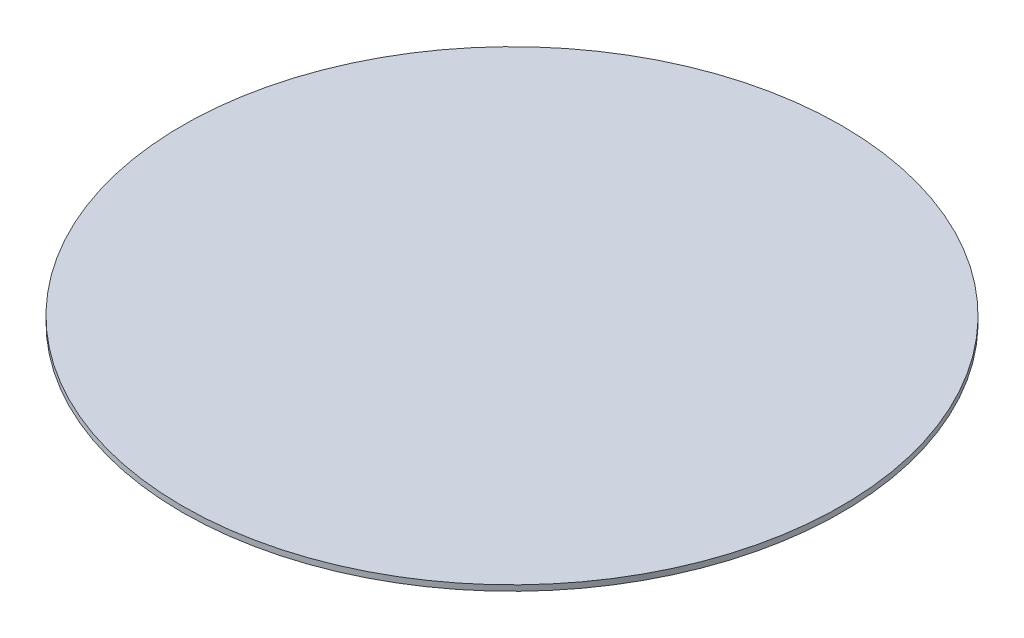
ISO-10303-21;
HEADER;
FILE_DESCRIPTION(('STEP AP214'),'2;1');
FILE_NAME('part.step','',(''),(''),'','','');
FILE_SCHEMA(('AUTOMOTIVE_DESIGN { 1 0 10303 214 1 1 1 1 }'));
ENDSEC;
DATA;
#1=APPLICATION_CONTEXT('core data for automotive mechanical design processes');
#2=APPLICATION_PROTOCOL_DEFINITION('international standard','automotive_design',2000,#1);
#3=PRODUCT_CONTEXT('',#1,'mechanical');
#4=PRODUCT('Part','Part','',(#3));
#5=PRODUCT_RELATED_PRODUCT_CATEGORY('part','',(#4));
#6=PRODUCT_DEFINITION_FORMATION('','',#4);
#7=PRODUCT_DEFINITION_CONTEXT('part definition',#1,'design');
#8=PRODUCT_DEFINITION('design','',#6,#7);
#9=PRODUCT_DEFINITION_SHAPE('','',#8);
#10=(LENGTH_UNIT() NAMED_UNIT(*) SI_UNIT(.MILLI.,.METRE.));
#11=(NAMED_UNIT(*) PLANE_ANGLE_UNIT() SI_UNIT($,.RADIAN.));
#12=(NAMED_UNIT(*) SI_UNIT($,.STERADIAN.) SOLID_ANGLE_UNIT());
#13=UNCERTAINTY_MEASURE_WITH_UNIT(LENGTH_MEASURE(1.E-05),#10,'distance_accuracy_value','');
#14=(GEOMETRIC_REPRESENTATION_CONTEXT(3) GLOBAL_UNCERTAINTY_ASSIGNED_CONTEXT((#13)) GLOBAL_UNIT_ASSIGNED_CONTEXT((#10,
#11,#12)) REPRESENTATION_CONTEXT('',''));
#15=CARTESIAN_POINT('',(0.,0.,0.));
#16=DIRECTION('',(0.,0.,1.));
#17=DIRECTION('',(1.,0.,0.));
#18=AXIS2_PLACEMENT_3D('',#15,#16,#17);
#19=CARTESIAN_POINT('',(0.,2.75,0.));
#20=DIRECTION('',(0.,-1.,0.));
#21=DIRECTION('',(0.,0.,-1.));
#22=AXIS2_PLACEMENT_3D('',#19,#20,#21);
#23=CYLINDRICAL_SURFACE('',#22,161.5);
#24=CARTESIAN_POINT('',(0.,2.75,0.));
#25=DIRECTION('',(0.,1.,0.));
#26=DIRECTION('',(0.,0.,1.));
#27=AXIS2_PLACEMENT_3D('',#24,#25,#26);
#28=CIRCLE('',#27,161.5);
#29=CARTESIAN_POINT('',(0.,2.75,161.5));
#30=VERTEX_POINT('',#29);
#31=EDGE_CURVE('E10',#30,#30,#28,.T.);
#32=ORIENTED_EDGE('',*,*,#31,.F.);
#33=EDGE_LOOP('',(#32));
#34=FACE_BOUND('',#33,.T.);
#35=CARTESIAN_POINT('',(0.,0.,0.));
#36=DIRECTION('',(0.,1.,0.));
#37=DIRECTION('',(0.,0.,1.));
#38=AXIS2_PLACEMENT_3D('',#35,#36,#37);
#39=CIRCLE('',#38,161.5);
#40=CARTESIAN_POINT('',(0.,0.,161.5));
#41=VERTEX_POINT('',#40);
#42=EDGE_CURVE('E36',#41,#41,#39,.T.);
#43=ORIENTED_EDGE('',*,*,#42,.T.);
#44=EDGE_LOOP('',(#43));
#45=FACE_BOUND('',#44,.T.);
#46=ADVANCED_FACE('F33',(#34,#45),#23,.T.);
#47=CARTESIAN_POINT('',(0.,2.75,0.));
#48=DIRECTION('',(0.,1.,0.));
#49=DIRECTION('',(0.,0.,1.));
#50=AXIS2_PLACEMENT_3D('',#47,#48,#49);
#51=PLANE('',#50);
#52=ORIENTED_EDGE('',*,*,#31,.T.);
#53=EDGE_LOOP('',(#52));
#54=FACE_BOUND('',#53,.T.);
#55=ADVANCED_FACE('F48',(#54),#51,.T.);
#56=CARTESIAN_POINT('',(0.,0.,0.));
#57=DIRECTION('',(0.,1.,0.));
#58=DIRECTION('',(0.,0.,1.));
#59=AXIS2_PLACEMENT_3D('',#56,#57,#58);
#60=PLANE('',#59);
#61=ORIENTED_EDGE('',*,*,#42,.F.);
#62=EDGE_LOOP('',(#61));
#63=FACE_BOUND('',#62,.T.);
#64=ADVANCED_FACE('F46',(#63),#60,.F.);
#65=CLOSED_SHELL('',(#46,#55,#64));
#66=MANIFOLD_SOLID_BREP('B2',#65);
#67=ADVANCED_BREP_SHAPE_REPRESENTATION('',(#18,#66),#14);
#68=SHAPE_DEFINITION_REPRESENTATION(#9,#67);
ENDSEC;
END-ISO-10303-21;
